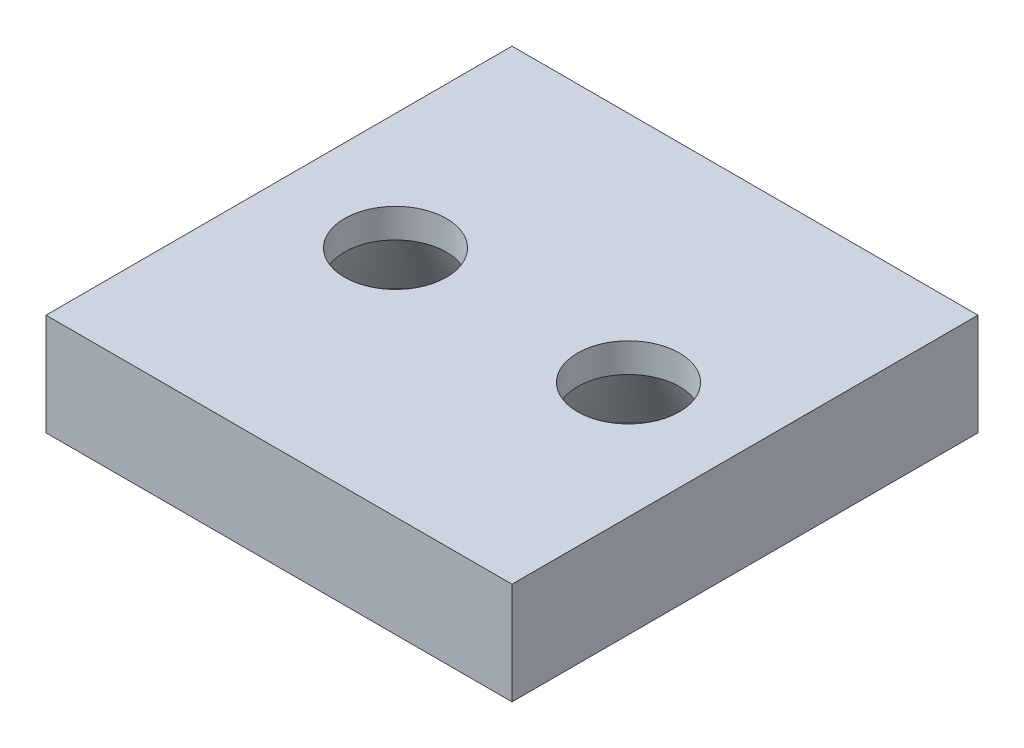
ISO-10303-21;
HEADER;
FILE_DESCRIPTION(('STEP AP214'),'2;1');
FILE_NAME('part.step','',(''),(''),'','','');
FILE_SCHEMA(('AUTOMOTIVE_DESIGN { 1 0 10303 214 1 1 1 1 }'));
ENDSEC;
DATA;
#1=APPLICATION_CONTEXT('core data for automotive mechanical design processes');
#2=APPLICATION_PROTOCOL_DEFINITION('international standard','automotive_design',2000,#1);
#3=PRODUCT_CONTEXT('',#1,'mechanical');
#4=PRODUCT('Part','Part','',(#3));
#5=PRODUCT_RELATED_PRODUCT_CATEGORY('part','',(#4));
#6=PRODUCT_DEFINITION_FORMATION('','',#4);
#7=PRODUCT_DEFINITION_CONTEXT('part definition',#1,'design');
#8=PRODUCT_DEFINITION('design','',#6,#7);
#9=PRODUCT_DEFINITION_SHAPE('','',#8);
#10=(LENGTH_UNIT() NAMED_UNIT(*) SI_UNIT(.MILLI.,.METRE.));
#11=(NAMED_UNIT(*) PLANE_ANGLE_UNIT() SI_UNIT($,.RADIAN.));
#12=(NAMED_UNIT(*) SI_UNIT($,.STERADIAN.) SOLID_ANGLE_UNIT());
#13=UNCERTAINTY_MEASURE_WITH_UNIT(LENGTH_MEASURE(1.E-05),#10,'distance_accuracy_value','');
#14=(GEOMETRIC_REPRESENTATION_CONTEXT(3) GLOBAL_UNCERTAINTY_ASSIGNED_CONTEXT((#13)) GLOBAL_UNIT_ASSIGNED_CONTEXT((#10,
#11,#12)) REPRESENTATION_CONTEXT('',''));
#15=CARTESIAN_POINT('',(0.,0.,0.));
#16=DIRECTION('',(0.,0.,1.));
#17=DIRECTION('',(1.,0.,0.));
#18=AXIS2_PLACEMENT_3D('',#15,#16,#17);
#19=CARTESIAN_POINT('',(16.,7.,-16.));
#20=DIRECTION('',(-1.,0.,0.));
#21=DIRECTION('',(0.,0.,1.));
#22=AXIS2_PLACEMENT_3D('',#19,#20,#21);
#23=PLANE('',#22);
#24=DIRECTION('',(0.,0.,-1.));
#25=VECTOR('',#24,1.);
#26=CARTESIAN_POINT('',(16.,0.,-16.));
#27=LINE('',#26,#25);
#28=CARTESIAN_POINT('',(16.,0.,16.));
#29=VERTEX_POINT('',#28);
#30=CARTESIAN_POINT('',(16.,0.,-16.));
#31=VERTEX_POINT('',#30);
#32=EDGE_CURVE('E109',#29,#31,#27,.T.);
#33=ORIENTED_EDGE('',*,*,#32,.T.);
#34=DIRECTION('',(0.,-1.,0.));
#35=VECTOR('',#34,1.);
#36=CARTESIAN_POINT('',(16.,7.,-16.));
#37=LINE('',#36,#35);
#38=CARTESIAN_POINT('',(16.,7.,-16.));
#39=VERTEX_POINT('',#38);
#40=EDGE_CURVE('E11',#39,#31,#37,.T.);
#41=ORIENTED_EDGE('',*,*,#40,.F.);
#42=DIRECTION('',(0.,0.,-1.));
#43=VECTOR('',#42,1.);
#44=CARTESIAN_POINT('',(16.,7.,-16.));
#45=LINE('',#44,#43);
#46=CARTESIAN_POINT('',(16.,7.,16.));
#47=VERTEX_POINT('',#46);
#48=EDGE_CURVE('E92',#47,#39,#45,.T.);
#49=ORIENTED_EDGE('',*,*,#48,.F.);
#50=DIRECTION('',(0.,-1.,0.));
#51=VECTOR('',#50,1.);
#52=CARTESIAN_POINT('',(16.,7.,16.));
#53=LINE('',#52,#51);
#54=EDGE_CURVE('E105',#47,#29,#53,.T.);
#55=ORIENTED_EDGE('',*,*,#54,.T.);
#56=EDGE_LOOP('',(#33,#41,#49,#55));
#57=FACE_BOUND('',#56,.T.);
#58=ADVANCED_FACE('F39',(#57),#23,.F.);
#59=CARTESIAN_POINT('',(-16.,7.,-16.));
#60=DIRECTION('',(0.,0.,1.));
#61=DIRECTION('',(1.,0.,0.));
#62=AXIS2_PLACEMENT_3D('',#59,#60,#61);
#63=PLANE('',#62);
#64=DIRECTION('',(-1.,0.,0.));
#65=VECTOR('',#64,1.);
#66=CARTESIAN_POINT('',(-16.,0.,-16.));
#67=LINE('',#66,#65);
#68=CARTESIAN_POINT('',(-16.,0.,-16.));
#69=VERTEX_POINT('',#68);
#70=EDGE_CURVE('E97',#31,#69,#67,.T.);
#71=ORIENTED_EDGE('',*,*,#70,.T.);
#72=DIRECTION('',(0.,-1.,0.));
#73=VECTOR('',#72,1.);
#74=CARTESIAN_POINT('',(-16.,7.,-16.));
#75=LINE('',#74,#73);
#76=CARTESIAN_POINT('',(-16.,7.,-16.));
#77=VERTEX_POINT('',#76);
#78=EDGE_CURVE('E49',#77,#69,#75,.T.);
#79=ORIENTED_EDGE('',*,*,#78,.F.);
#80=DIRECTION('',(-1.,0.,0.));
#81=VECTOR('',#80,1.);
#82=CARTESIAN_POINT('',(-16.,7.,-16.));
#83=LINE('',#82,#81);
#84=EDGE_CURVE('E87',#39,#77,#83,.T.);
#85=ORIENTED_EDGE('',*,*,#84,.F.);
#86=ORIENTED_EDGE('',*,*,#40,.T.);
#87=EDGE_LOOP('',(#71,#79,#85,#86));
#88=FACE_BOUND('',#87,.T.);
#89=ADVANCED_FACE('F96',(#88),#63,.F.);
#90=CARTESIAN_POINT('',(-16.,7.,-16.));
#91=DIRECTION('',(1.,0.,0.));
#92=DIRECTION('',(0.,0.,-1.));
#93=AXIS2_PLACEMENT_3D('',#90,#91,#92);
#94=PLANE('',#93);
#95=DIRECTION('',(0.,0.,1.));
#96=VECTOR('',#95,1.);
#97=CARTESIAN_POINT('',(-16.,0.,-16.));
#98=LINE('',#97,#96);
#99=CARTESIAN_POINT('',(-16.,0.,16.));
#100=VERTEX_POINT('',#99);
#101=EDGE_CURVE('E74',#69,#100,#98,.T.);
#102=ORIENTED_EDGE('',*,*,#101,.T.);
#103=DIRECTION('',(0.,-1.,0.));
#104=VECTOR('',#103,1.);
#105=CARTESIAN_POINT('',(-16.,7.,16.));
#106=LINE('',#105,#104);
#107=CARTESIAN_POINT('',(-16.,7.,16.));
#108=VERTEX_POINT('',#107);
#109=EDGE_CURVE('E99',#108,#100,#106,.T.);
#110=ORIENTED_EDGE('',*,*,#109,.F.);
#111=DIRECTION('',(0.,0.,1.));
#112=VECTOR('',#111,1.);
#113=CARTESIAN_POINT('',(-16.,7.,-16.));
#114=LINE('',#113,#112);
#115=EDGE_CURVE('E90',#77,#108,#114,.T.);
#116=ORIENTED_EDGE('',*,*,#115,.F.);
#117=ORIENTED_EDGE('',*,*,#78,.T.);
#118=EDGE_LOOP('',(#102,#110,#116,#117));
#119=FACE_BOUND('',#118,.T.);
#120=ADVANCED_FACE('F101',(#119),#94,.F.);
#121=CARTESIAN_POINT('',(-16.,7.,16.));
#122=DIRECTION('',(0.,0.,-1.));
#123=DIRECTION('',(-1.,0.,0.));
#124=AXIS2_PLACEMENT_3D('',#121,#122,#123);
#125=PLANE('',#124);
#126=DIRECTION('',(1.,0.,0.));
#127=VECTOR('',#126,1.);
#128=CARTESIAN_POINT('',(-16.,0.,16.));
#129=LINE('',#128,#127);
#130=EDGE_CURVE('E80',#100,#29,#129,.T.);
#131=ORIENTED_EDGE('',*,*,#130,.T.);
#132=ORIENTED_EDGE('',*,*,#54,.F.);
#133=DIRECTION('',(1.,0.,0.));
#134=VECTOR('',#133,1.);
#135=CARTESIAN_POINT('',(-16.,7.,16.));
#136=LINE('',#135,#134);
#137=EDGE_CURVE('E57',#108,#47,#136,.T.);
#138=ORIENTED_EDGE('',*,*,#137,.F.);
#139=ORIENTED_EDGE('',*,*,#109,.T.);
#140=EDGE_LOOP('',(#131,#132,#138,#139));
#141=FACE_BOUND('',#140,.T.);
#142=ADVANCED_FACE('F122',(#141),#125,.F.);
#143=CARTESIAN_POINT('',(0.,7.,0.));
#144=DIRECTION('',(0.,1.,0.));
#145=DIRECTION('',(0.,0.,1.));
#146=AXIS2_PLACEMENT_3D('',#143,#144,#145);
#147=PLANE('',#146);
#148=CARTESIAN_POINT('',(7.99999999999999,7.,0.));
#149=DIRECTION('',(0.,1.,0.));
#150=DIRECTION('',(0.,0.,1.));
#151=AXIS2_PLACEMENT_3D('',#148,#149,#150);
#152=CIRCLE('',#151,3.5);
#153=CARTESIAN_POINT('',(7.99999999999999,7.,3.5));
#154=VERTEX_POINT('',#153);
#155=EDGE_CURVE('E141',#154,#154,#152,.T.);
#156=ORIENTED_EDGE('',*,*,#155,.F.);
#157=EDGE_LOOP('',(#156));
#158=FACE_BOUND('',#157,.T.);
#159=CARTESIAN_POINT('',(-8.00000000000001,7.,0.));
#160=DIRECTION('',(0.,1.,0.));
#161=DIRECTION('',(0.,0.,1.));
#162=AXIS2_PLACEMENT_3D('',#159,#160,#161);
#163=CIRCLE('',#162,3.5);
#164=CARTESIAN_POINT('',(-8.00000000000001,7.,3.5));
#165=VERTEX_POINT('',#164);
#166=EDGE_CURVE('E42',#165,#165,#163,.T.);
#167=ORIENTED_EDGE('',*,*,#166,.F.);
#168=EDGE_LOOP('',(#167));
#169=FACE_BOUND('',#168,.T.);
#170=ORIENTED_EDGE('',*,*,#48,.T.);
#171=ORIENTED_EDGE('',*,*,#84,.T.);
#172=ORIENTED_EDGE('',*,*,#115,.T.);
#173=ORIENTED_EDGE('',*,*,#137,.T.);
#174=EDGE_LOOP('',(#170,#171,#172,#173));
#175=FACE_BOUND('',#174,.T.);
#176=ADVANCED_FACE('F88',(#158,#169,#175),#147,.T.);
#177=CARTESIAN_POINT('',(0.,0.,0.));
#178=DIRECTION('',(0.,1.,0.));
#179=DIRECTION('',(0.,0.,1.));
#180=AXIS2_PLACEMENT_3D('',#177,#178,#179);
#181=PLANE('',#180);
#182=CARTESIAN_POINT('',(7.99999999999999,0.,0.));
#183=DIRECTION('',(0.,-1.,0.));
#184=DIRECTION('',(0.,0.,-1.));
#185=AXIS2_PLACEMENT_3D('',#182,#183,#184);
#186=CIRCLE('',#185,6.5);
#187=CARTESIAN_POINT('',(7.99999999999999,0.,-6.5));
#188=VERTEX_POINT('',#187);
#189=EDGE_CURVE('E145',#188,#188,#186,.T.);
#190=ORIENTED_EDGE('',*,*,#189,.F.);
#191=EDGE_LOOP('',(#190));
#192=FACE_BOUND('',#191,.T.);
#193=CARTESIAN_POINT('',(-8.00000000000001,0.,0.));
#194=DIRECTION('',(0.,-1.,0.));
#195=DIRECTION('',(0.,0.,-1.));
#196=AXIS2_PLACEMENT_3D('',#193,#194,#195);
#197=CIRCLE('',#196,6.5);
#198=CARTESIAN_POINT('',(-8.00000000000001,0.,-6.5));
#199=VERTEX_POINT('',#198);
#200=EDGE_CURVE('E133',#199,#199,#197,.T.);
#201=ORIENTED_EDGE('',*,*,#200,.F.);
#202=EDGE_LOOP('',(#201));
#203=FACE_BOUND('',#202,.T.);
#204=ORIENTED_EDGE('',*,*,#32,.F.);
#205=ORIENTED_EDGE('',*,*,#130,.F.);
#206=ORIENTED_EDGE('',*,*,#101,.F.);
#207=ORIENTED_EDGE('',*,*,#70,.F.);
#208=EDGE_LOOP('',(#204,#205,#206,#207));
#209=FACE_BOUND('',#208,.T.);
#210=ADVANCED_FACE('F125',(#192,#203,#209),#181,.F.);
#211=CARTESIAN_POINT('',(-8.00000000000001,0.,0.));
#212=DIRECTION('',(0.,-1.,0.));
#213=DIRECTION('',(0.,0.,-1.));
#214=AXIS2_PLACEMENT_3D('',#211,#212,#213);
#215=CYLINDRICAL_SURFACE('',#214,3.5);
#216=ORIENTED_EDGE('',*,*,#166,.T.);
#217=EDGE_LOOP('',(#216));
#218=FACE_BOUND('',#217,.T.);
#219=CARTESIAN_POINT('',(-8.00000000000001,4.99975404598916,0.));
#220=DIRECTION('',(0.,-1.,0.));
#221=DIRECTION('',(0.,0.,-1.));
#222=AXIS2_PLACEMENT_3D('',#219,#220,#221);
#223=CIRCLE('',#222,3.5);
#224=CARTESIAN_POINT('',(-8.00000000000001,4.99975404598916,-3.5));
#225=VERTEX_POINT('',#224);
#226=EDGE_CURVE('E129',#225,#225,#223,.T.);
#227=ORIENTED_EDGE('',*,*,#226,.T.);
#228=EDGE_LOOP('',(#227));
#229=FACE_BOUND('',#228,.T.);
#230=ADVANCED_FACE('F154',(#218,#229),#215,.F.);
#231=CARTESIAN_POINT('',(-8.00000000000001,0.,0.));
#232=DIRECTION('',(0.,-1.,0.));
#233=DIRECTION('',(0.,0.,-1.));
#234=AXIS2_PLACEMENT_3D('',#231,#232,#233);
#235=CONICAL_SURFACE('',#234,6.5,0.540441202880044);
#236=ORIENTED_EDGE('',*,*,#226,.F.);
#237=EDGE_LOOP('',(#236));
#238=FACE_BOUND('',#237,.T.);
#239=ORIENTED_EDGE('',*,*,#200,.T.);
#240=EDGE_LOOP('',(#239));
#241=FACE_BOUND('',#240,.T.);
#242=ADVANCED_FACE('F158',(#238,#241),#235,.F.);
#243=CARTESIAN_POINT('',(7.99999999999999,0.,0.));
#244=DIRECTION('',(0.,-1.,0.));
#245=DIRECTION('',(0.,0.,-1.));
#246=AXIS2_PLACEMENT_3D('',#243,#244,#245);
#247=CYLINDRICAL_SURFACE('',#246,3.5);
#248=ORIENTED_EDGE('',*,*,#155,.T.);
#249=EDGE_LOOP('',(#248));
#250=FACE_BOUND('',#249,.T.);
#251=CARTESIAN_POINT('',(7.99999999999999,4.99975404598916,0.));
#252=DIRECTION('',(0.,-1.,0.));
#253=DIRECTION('',(0.,0.,-1.));
#254=AXIS2_PLACEMENT_3D('',#251,#252,#253);
#255=CIRCLE('',#254,3.5);
#256=CARTESIAN_POINT('',(7.99999999999999,4.99975404598916,-3.5));
#257=VERTEX_POINT('',#256);
#258=EDGE_CURVE('E137',#257,#257,#255,.T.);
#259=ORIENTED_EDGE('',*,*,#258,.T.);
#260=EDGE_LOOP('',(#259));
#261=FACE_BOUND('',#260,.T.);
#262=ADVANCED_FACE('F160',(#250,#261),#247,.F.);
#263=CARTESIAN_POINT('',(7.99999999999999,0.,0.));
#264=DIRECTION('',(0.,-1.,0.));
#265=DIRECTION('',(0.,0.,-1.));
#266=AXIS2_PLACEMENT_3D('',#263,#264,#265);
#267=CONICAL_SURFACE('',#266,6.5,0.540441202880044);
#268=ORIENTED_EDGE('',*,*,#258,.F.);
#269=EDGE_LOOP('',(#268));
#270=FACE_BOUND('',#269,.T.);
#271=ORIENTED_EDGE('',*,*,#189,.T.);
#272=EDGE_LOOP('',(#271));
#273=FACE_BOUND('',#272,.T.);
#274=ADVANCED_FACE('F150',(#270,#273),#267,.F.);
#275=CLOSED_SHELL('',(#58,#89,#120,#142,#176,#210,#230,#242,#262,#274));
#276=MANIFOLD_SOLID_BREP('B2',#275);
#277=ADVANCED_BREP_SHAPE_REPRESENTATION('',(#18,#276),#14);
#278=SHAPE_DEFINITION_REPRESENTATION(#9,#277);
ENDSEC;
END-ISO-10303-21;
